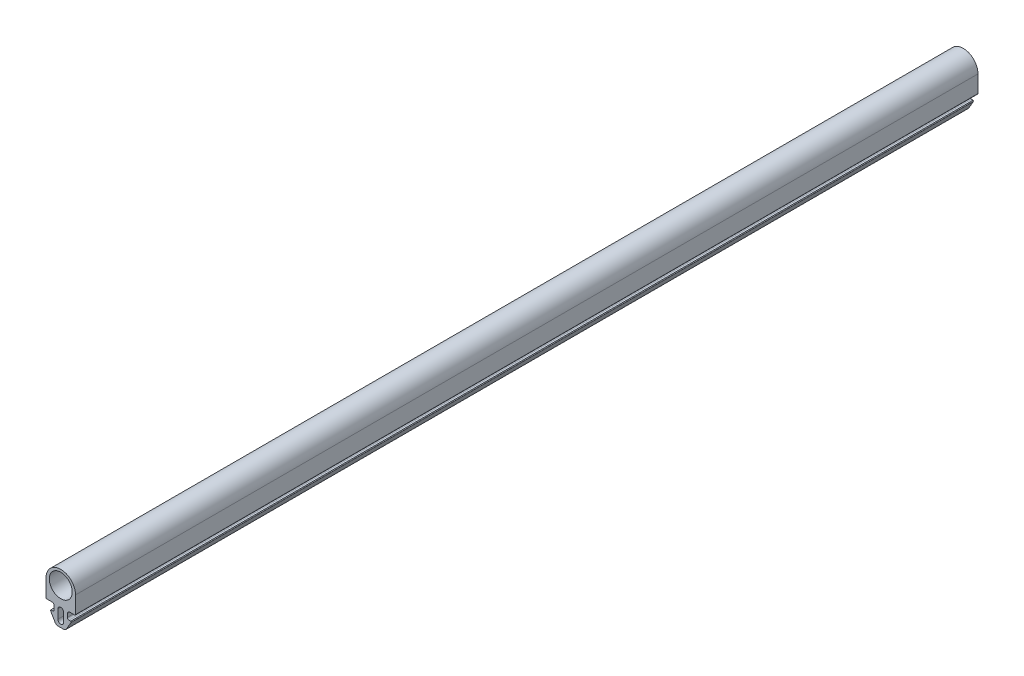
ISO-10303-21;
HEADER;
FILE_DESCRIPTION(('STEP AP214'),'2;1');
FILE_NAME('part.step','',(''),(''),'','','');
FILE_SCHEMA(('AUTOMOTIVE_DESIGN { 1 0 10303 214 1 1 1 1 }'));
ENDSEC;
DATA;
#1=APPLICATION_CONTEXT('core data for automotive mechanical design processes');
#2=APPLICATION_PROTOCOL_DEFINITION('international standard','automotive_design',2000,#1);
#3=PRODUCT_CONTEXT('',#1,'mechanical');
#4=PRODUCT('Part','Part','',(#3));
#5=PRODUCT_RELATED_PRODUCT_CATEGORY('part','',(#4));
#6=PRODUCT_DEFINITION_FORMATION('','',#4);
#7=PRODUCT_DEFINITION_CONTEXT('part definition',#1,'design');
#8=PRODUCT_DEFINITION('design','',#6,#7);
#9=PRODUCT_DEFINITION_SHAPE('','',#8);
#10=(LENGTH_UNIT() NAMED_UNIT(*) SI_UNIT(.MILLI.,.METRE.));
#11=(NAMED_UNIT(*) PLANE_ANGLE_UNIT() SI_UNIT($,.RADIAN.));
#12=(NAMED_UNIT(*) SI_UNIT($,.STERADIAN.) SOLID_ANGLE_UNIT());
#13=UNCERTAINTY_MEASURE_WITH_UNIT(LENGTH_MEASURE(1.E-05),#10,'distance_accuracy_value','');
#14=(GEOMETRIC_REPRESENTATION_CONTEXT(3) GLOBAL_UNCERTAINTY_ASSIGNED_CONTEXT((#13)) GLOBAL_UNIT_ASSIGNED_CONTEXT((#10,
#11,#12)) REPRESENTATION_CONTEXT('',''));
#15=CARTESIAN_POINT('',(0.,0.,0.));
#16=DIRECTION('',(0.,0.,1.));
#17=DIRECTION('',(1.,0.,0.));
#18=AXIS2_PLACEMENT_3D('',#15,#16,#17);
#19=CARTESIAN_POINT('',(1.89605275924265E-12,10.8645868639071,-530.));
#20=DIRECTION('',(0.,0.,1.));
#21=DIRECTION('',(1.,0.,0.));
#22=AXIS2_PLACEMENT_3D('',#19,#20,#21);
#23=CYLINDRICAL_SURFACE('',#22,8.99999999999883);
#24=CARTESIAN_POINT('',(1.89605275924265E-12,10.8645868639071,20.));
#25=DIRECTION('',(0.,0.,1.));
#26=DIRECTION('',(1.,0.,0.));
#27=AXIS2_PLACEMENT_3D('',#24,#25,#26);
#28=CIRCLE('',#27,8.99999999999883);
#29=CARTESIAN_POINT('',(9.00000000000078,10.8645868639071,20.));
#30=VERTEX_POINT('',#29);
#31=CARTESIAN_POINT('',(-8.99999999999688,10.8645868639071,20.));
#32=VERTEX_POINT('',#31);
#33=EDGE_CURVE('E245',#30,#32,#28,.T.);
#34=ORIENTED_EDGE('',*,*,#33,.F.);
#35=DIRECTION('',(0.,0.,1.));
#36=VECTOR('',#35,1.);
#37=CARTESIAN_POINT('',(9.00000000000078,10.8645868639071,-530.));
#38=LINE('',#37,#36);
#39=CARTESIAN_POINT('',(9.00000000000078,10.8645868639071,-530.));
#40=VERTEX_POINT('',#39);
#41=EDGE_CURVE('E11',#40,#30,#38,.T.);
#42=ORIENTED_EDGE('',*,*,#41,.F.);
#43=CARTESIAN_POINT('',(1.89605275924265E-12,10.8645868639071,-530.));
#44=DIRECTION('',(0.,0.,1.));
#45=DIRECTION('',(1.,0.,0.));
#46=AXIS2_PLACEMENT_3D('',#43,#44,#45);
#47=CIRCLE('',#46,8.99999999999883);
#48=CARTESIAN_POINT('',(-8.99999999999688,10.8645868639071,-530.));
#49=VERTEX_POINT('',#48);
#50=EDGE_CURVE('E249',#40,#49,#47,.T.);
#51=ORIENTED_EDGE('',*,*,#50,.T.);
#52=DIRECTION('',(0.,0.,1.));
#53=VECTOR('',#52,1.);
#54=CARTESIAN_POINT('',(-8.99999999999688,10.8645868639071,-530.));
#55=LINE('',#54,#53);
#56=EDGE_CURVE('E38',#49,#32,#55,.T.);
#57=ORIENTED_EDGE('',*,*,#56,.T.);
#58=EDGE_LOOP('',(#34,#42,#51,#57));
#59=FACE_BOUND('',#58,.T.);
#60=ADVANCED_FACE('F35',(#59),#23,.T.);
#61=CARTESIAN_POINT('',(9.00000000000088,0.52392483735149,-530.));
#62=DIRECTION('',(1.,0.,0.));
#63=DIRECTION('',(0.,1.,0.));
#64=AXIS2_PLACEMENT_3D('',#61,#62,#63);
#65=PLANE('',#64);
#66=DIRECTION('',(0.,1.,0.));
#67=VECTOR('',#66,1.);
#68=CARTESIAN_POINT('',(9.00000000000088,0.52392483735149,20.));
#69=LINE('',#68,#67);
#70=CARTESIAN_POINT('',(9.00000000000088,0.52392483735149,20.));
#71=VERTEX_POINT('',#70);
#72=EDGE_CURVE('E253',#71,#30,#69,.T.);
#73=ORIENTED_EDGE('',*,*,#72,.F.);
#74=DIRECTION('',(0.,0.,1.));
#75=VECTOR('',#74,1.);
#76=CARTESIAN_POINT('',(9.00000000000088,0.52392483735149,-530.));
#77=LINE('',#76,#75);
#78=CARTESIAN_POINT('',(9.00000000000088,0.52392483735149,-530.));
#79=VERTEX_POINT('',#78);
#80=EDGE_CURVE('E43',#79,#71,#77,.T.);
#81=ORIENTED_EDGE('',*,*,#80,.F.);
#82=DIRECTION('',(0.,1.,0.));
#83=VECTOR('',#82,1.);
#84=CARTESIAN_POINT('',(9.00000000000088,0.52392483735149,-530.));
#85=LINE('',#84,#83);
#86=EDGE_CURVE('E313',#79,#40,#85,.T.);
#87=ORIENTED_EDGE('',*,*,#86,.T.);
#88=ORIENTED_EDGE('',*,*,#41,.T.);
#89=EDGE_LOOP('',(#73,#81,#87,#88));
#90=FACE_BOUND('',#89,.T.);
#91=ADVANCED_FACE('F430',(#90),#65,.T.);
#92=CARTESIAN_POINT('',(8.50059730669664,0.499492278712887,-530.));
#93=DIRECTION('',(0.,0.,1.));
#94=DIRECTION('',(1.,0.,0.));
#95=AXIS2_PLACEMENT_3D('',#92,#93,#94);
#96=CYLINDRICAL_SURFACE('',#95,0.50000000000115);
#97=CARTESIAN_POINT('',(8.50059730669664,0.499492278712887,20.));
#98=DIRECTION('',(0.,0.,1.));
#99=DIRECTION('',(1.,0.,0.));
#100=AXIS2_PLACEMENT_3D('',#97,#98,#99);
#101=CIRCLE('',#100,0.50000000000115);
#102=CARTESIAN_POINT('',(8.47807035601008,-1.22623265708111E-13,20.));
#103=VERTEX_POINT('',#102);
#104=EDGE_CURVE('E375',#103,#71,#101,.T.);
#105=ORIENTED_EDGE('',*,*,#104,.F.);
#106=DIRECTION('',(0.,0.,1.));
#107=VECTOR('',#106,1.);
#108=CARTESIAN_POINT('',(8.47807035601008,-1.22623265708111E-13,-530.));
#109=LINE('',#108,#107);
#110=CARTESIAN_POINT('',(8.47807035601008,-1.22623265708111E-13,-530.));
#111=VERTEX_POINT('',#110);
#112=EDGE_CURVE('E381',#111,#103,#109,.T.);
#113=ORIENTED_EDGE('',*,*,#112,.F.);
#114=CARTESIAN_POINT('',(8.50059730669664,0.499492278712887,-530.));
#115=DIRECTION('',(0.,0.,1.));
#116=DIRECTION('',(1.,0.,0.));
#117=AXIS2_PLACEMENT_3D('',#114,#115,#116);
#118=CIRCLE('',#117,0.50000000000115);
#119=EDGE_CURVE('E310',#111,#79,#118,.T.);
#120=ORIENTED_EDGE('',*,*,#119,.T.);
#121=ORIENTED_EDGE('',*,*,#80,.T.);
#122=EDGE_LOOP('',(#105,#113,#120,#121));
#123=FACE_BOUND('',#122,.T.);
#124=ADVANCED_FACE('F505',(#123),#96,.T.);
#125=CARTESIAN_POINT('',(5.49999999999965,-1.15033850500712E-13,-530.));
#126=DIRECTION('',(0.,-1.,0.));
#127=DIRECTION('',(1.,0.,0.));
#128=AXIS2_PLACEMENT_3D('',#125,#126,#127);
#129=PLANE('',#128);
#130=DIRECTION('',(1.,0.,0.));
#131=VECTOR('',#130,1.);
#132=CARTESIAN_POINT('',(5.49999999999965,-1.15033850500712E-13,20.));
#133=LINE('',#132,#131);
#134=CARTESIAN_POINT('',(5.49999999999965,-1.15033850500712E-13,20.));
#135=VERTEX_POINT('',#134);
#136=EDGE_CURVE('E372',#135,#103,#133,.T.);
#137=ORIENTED_EDGE('',*,*,#136,.F.);
#138=DIRECTION('',(0.,0.,1.));
#139=VECTOR('',#138,1.);
#140=CARTESIAN_POINT('',(5.49999999999965,-1.15033850500712E-13,-530.));
#141=LINE('',#140,#139);
#142=CARTESIAN_POINT('',(5.49999999999965,-1.15033850500712E-13,-530.));
#143=VERTEX_POINT('',#142);
#144=EDGE_CURVE('E383',#143,#135,#141,.T.);
#145=ORIENTED_EDGE('',*,*,#144,.F.);
#146=DIRECTION('',(1.,0.,0.));
#147=VECTOR('',#146,1.);
#148=CARTESIAN_POINT('',(5.49999999999965,-1.15033850500712E-13,-530.));
#149=LINE('',#148,#147);
#150=EDGE_CURVE('E307',#143,#111,#149,.T.);
#151=ORIENTED_EDGE('',*,*,#150,.T.);
#152=ORIENTED_EDGE('',*,*,#112,.T.);
#153=EDGE_LOOP('',(#137,#145,#151,#152));
#154=FACE_BOUND('',#153,.T.);
#155=ADVANCED_FACE('F503',(#154),#129,.T.);
#156=CARTESIAN_POINT('',(5.49999999999963,-1.50000000000017,-530.));
#157=DIRECTION('',(0.,0.,1.));
#158=DIRECTION('',(1.,0.,0.));
#159=AXIS2_PLACEMENT_3D('',#156,#157,#158);
#160=CYLINDRICAL_SURFACE('',#159,1.50000000000001);
#161=CARTESIAN_POINT('',(5.49999999999963,-1.50000000000017,20.));
#162=DIRECTION('',(0.,0.,-1.));
#163=DIRECTION('',(-1.,0.,0.));
#164=AXIS2_PLACEMENT_3D('',#161,#162,#163);
#165=CIRCLE('',#164,1.50000000000001);
#166=CARTESIAN_POINT('',(3.99999999999962,-1.50000000000015,20.));
#167=VERTEX_POINT('',#166);
#168=EDGE_CURVE('E369',#167,#135,#165,.T.);
#169=ORIENTED_EDGE('',*,*,#168,.F.);
#170=DIRECTION('',(0.,0.,1.));
#171=VECTOR('',#170,1.);
#172=CARTESIAN_POINT('',(3.99999999999962,-1.50000000000015,-530.));
#173=LINE('',#172,#171);
#174=CARTESIAN_POINT('',(3.99999999999962,-1.50000000000015,-530.));
#175=VERTEX_POINT('',#174);
#176=EDGE_CURVE('E385',#175,#167,#173,.T.);
#177=ORIENTED_EDGE('',*,*,#176,.F.);
#178=CARTESIAN_POINT('',(5.49999999999963,-1.50000000000017,-530.));
#179=DIRECTION('',(0.,0.,-1.));
#180=DIRECTION('',(-1.,0.,0.));
#181=AXIS2_PLACEMENT_3D('',#178,#179,#180);
#182=CIRCLE('',#181,1.50000000000001);
#183=EDGE_CURVE('E304',#175,#143,#182,.T.);
#184=ORIENTED_EDGE('',*,*,#183,.T.);
#185=ORIENTED_EDGE('',*,*,#144,.T.);
#186=EDGE_LOOP('',(#169,#177,#184,#185));
#187=FACE_BOUND('',#186,.T.);
#188=ADVANCED_FACE('F499',(#187),#160,.F.);
#189=CARTESIAN_POINT('',(3.9999999999997,-3.49999999999885,-530.));
#190=DIRECTION('',(1.,0.,0.));
#191=DIRECTION('',(0.,1.,0.));
#192=AXIS2_PLACEMENT_3D('',#189,#190,#191);
#193=PLANE('',#192);
#194=DIRECTION('',(0.,1.,0.));
#195=VECTOR('',#194,1.);
#196=CARTESIAN_POINT('',(3.9999999999997,-3.49999999999885,20.));
#197=LINE('',#196,#195);
#198=CARTESIAN_POINT('',(3.9999999999997,-3.49999999999885,20.));
#199=VERTEX_POINT('',#198);
#200=EDGE_CURVE('E366',#199,#167,#197,.T.);
#201=ORIENTED_EDGE('',*,*,#200,.F.);
#202=DIRECTION('',(0.,0.,1.));
#203=VECTOR('',#202,1.);
#204=CARTESIAN_POINT('',(3.9999999999997,-3.49999999999885,-530.));
#205=LINE('',#204,#203);
#206=CARTESIAN_POINT('',(3.9999999999997,-3.49999999999885,-530.));
#207=VERTEX_POINT('',#206);
#208=EDGE_CURVE('E387',#207,#199,#205,.T.);
#209=ORIENTED_EDGE('',*,*,#208,.F.);
#210=DIRECTION('',(0.,1.,0.));
#211=VECTOR('',#210,1.);
#212=CARTESIAN_POINT('',(3.9999999999997,-3.49999999999885,-530.));
#213=LINE('',#212,#211);
#214=EDGE_CURVE('E301',#207,#175,#213,.T.);
#215=ORIENTED_EDGE('',*,*,#214,.T.);
#216=ORIENTED_EDGE('',*,*,#176,.T.);
#217=EDGE_LOOP('',(#201,#209,#215,#216));
#218=FACE_BOUND('',#217,.T.);
#219=ADVANCED_FACE('F495',(#218),#193,.T.);
#220=CARTESIAN_POINT('',(4.9999999999997,-3.49999999999885,-530.));
#221=DIRECTION('',(0.,0.,1.));
#222=DIRECTION('',(1.,0.,0.));
#223=AXIS2_PLACEMENT_3D('',#220,#221,#222);
#224=CYLINDRICAL_SURFACE('',#223,1.);
#225=CARTESIAN_POINT('',(4.9999999999997,-3.49999999999885,20.));
#226=DIRECTION('',(0.,0.,-1.));
#227=DIRECTION('',(-1.,0.,0.));
#228=AXIS2_PLACEMENT_3D('',#225,#226,#227);
#229=CIRCLE('',#228,1.);
#230=CARTESIAN_POINT('',(4.9999999999997,-4.49999999999885,20.));
#231=VERTEX_POINT('',#230);
#232=EDGE_CURVE('E363',#231,#199,#229,.T.);
#233=ORIENTED_EDGE('',*,*,#232,.F.);
#234=DIRECTION('',(0.,0.,1.));
#235=VECTOR('',#234,1.);
#236=CARTESIAN_POINT('',(4.9999999999997,-4.49999999999885,-530.));
#237=LINE('',#236,#235);
#238=CARTESIAN_POINT('',(4.9999999999997,-4.49999999999885,-530.));
#239=VERTEX_POINT('',#238);
#240=EDGE_CURVE('E389',#239,#231,#237,.T.);
#241=ORIENTED_EDGE('',*,*,#240,.F.);
#242=CARTESIAN_POINT('',(4.9999999999997,-3.49999999999885,-530.));
#243=DIRECTION('',(0.,0.,-1.));
#244=DIRECTION('',(-1.,0.,0.));
#245=AXIS2_PLACEMENT_3D('',#242,#243,#244);
#246=CIRCLE('',#245,1.);
#247=EDGE_CURVE('E298',#239,#207,#246,.T.);
#248=ORIENTED_EDGE('',*,*,#247,.T.);
#249=ORIENTED_EDGE('',*,*,#208,.T.);
#250=EDGE_LOOP('',(#233,#241,#248,#249));
#251=FACE_BOUND('',#250,.T.);
#252=ADVANCED_FACE('F491',(#251),#224,.F.);
#253=CARTESIAN_POINT('',(6.0160076135011,-4.49999999999891,-530.));
#254=DIRECTION('',(0.,1.,0.));
#255=DIRECTION('',(-1.,0.,0.));
#256=AXIS2_PLACEMENT_3D('',#253,#254,#255);
#257=PLANE('',#256);
#258=DIRECTION('',(-1.,0.,0.));
#259=VECTOR('',#258,1.);
#260=CARTESIAN_POINT('',(6.0160076135011,-4.49999999999891,20.));
#261=LINE('',#260,#259);
#262=CARTESIAN_POINT('',(6.0160076135011,-4.49999999999891,20.));
#263=VERTEX_POINT('',#262);
#264=EDGE_CURVE('E360',#263,#231,#261,.T.);
#265=ORIENTED_EDGE('',*,*,#264,.F.);
#266=DIRECTION('',(0.,0.,1.));
#267=VECTOR('',#266,1.);
#268=CARTESIAN_POINT('',(6.0160076135011,-4.49999999999891,-530.));
#269=LINE('',#268,#267);
#270=CARTESIAN_POINT('',(6.0160076135011,-4.49999999999891,-530.));
#271=VERTEX_POINT('',#270);
#272=EDGE_CURVE('E391',#271,#263,#269,.T.);
#273=ORIENTED_EDGE('',*,*,#272,.F.);
#274=DIRECTION('',(-1.,0.,0.));
#275=VECTOR('',#274,1.);
#276=CARTESIAN_POINT('',(6.0160076135011,-4.49999999999891,-530.));
#277=LINE('',#276,#275);
#278=EDGE_CURVE('E295',#271,#239,#277,.T.);
#279=ORIENTED_EDGE('',*,*,#278,.T.);
#280=ORIENTED_EDGE('',*,*,#240,.T.);
#281=EDGE_LOOP('',(#265,#273,#279,#280));
#282=FACE_BOUND('',#281,.T.);
#283=ADVANCED_FACE('F487',(#282),#257,.T.);
#284=CARTESIAN_POINT('',(5.7411809549003,-4.91769643010379,-530.));
#285=DIRECTION('',(0.,0.,1.));
#286=DIRECTION('',(1.,0.,0.));
#287=AXIS2_PLACEMENT_3D('',#284,#285,#286);
#288=CYLINDRICAL_SURFACE('',#287,0.50000000000003);
#289=CARTESIAN_POINT('',(5.7411809549003,-4.91769643010379,20.));
#290=DIRECTION('',(0.,0.,1.));
#291=DIRECTION('',(1.,0.,0.));
#292=AXIS2_PLACEMENT_3D('',#289,#290,#291);
#293=CIRCLE('',#292,0.50000000000003);
#294=CARTESIAN_POINT('',(6.17419365679255,-5.1676964301038,20.));
#295=VERTEX_POINT('',#294);
#296=EDGE_CURVE('E357',#295,#263,#293,.T.);
#297=ORIENTED_EDGE('',*,*,#296,.F.);
#298=DIRECTION('',(0.,0.,1.));
#299=VECTOR('',#298,1.);
#300=CARTESIAN_POINT('',(6.17419365679255,-5.1676964301038,-530.));
#301=LINE('',#300,#299);
#302=CARTESIAN_POINT('',(6.17419365679255,-5.1676964301038,-530.));
#303=VERTEX_POINT('',#302);
#304=EDGE_CURVE('E393',#303,#295,#301,.T.);
#305=ORIENTED_EDGE('',*,*,#304,.F.);
#306=CARTESIAN_POINT('',(5.7411809549003,-4.91769643010379,-530.));
#307=DIRECTION('',(0.,0.,1.));
#308=DIRECTION('',(1.,0.,0.));
#309=AXIS2_PLACEMENT_3D('',#306,#307,#308);
#310=CIRCLE('',#309,0.50000000000003);
#311=EDGE_CURVE('E292',#303,#271,#310,.T.);
#312=ORIENTED_EDGE('',*,*,#311,.T.);
#313=ORIENTED_EDGE('',*,*,#272,.T.);
#314=EDGE_LOOP('',(#297,#305,#312,#313));
#315=FACE_BOUND('',#314,.T.);
#316=ADVANCED_FACE('F483',(#315),#288,.T.);
#317=CARTESIAN_POINT('',(3.44004357329789,-9.90338329023524,-530.));
#318=DIRECTION('',(0.866025403784439,-0.5,0.));
#319=DIRECTION('',(0.5,0.866025403784439,0.));
#320=AXIS2_PLACEMENT_3D('',#317,#318,#319);
#321=PLANE('',#320);
#322=DIRECTION('',(0.5,0.866025403784439,0.));
#323=VECTOR('',#322,1.);
#324=CARTESIAN_POINT('',(3.44004357329789,-9.90338329023524,20.));
#325=LINE('',#324,#323);
#326=CARTESIAN_POINT('',(3.44004357329789,-9.90338329023524,20.));
#327=VERTEX_POINT('',#326);
#328=EDGE_CURVE('E354',#327,#295,#325,.T.);
#329=ORIENTED_EDGE('',*,*,#328,.F.);
#330=DIRECTION('',(0.,0.,1.));
#331=VECTOR('',#330,1.);
#332=CARTESIAN_POINT('',(3.44004357329789,-9.90338329023524,-530.));
#333=LINE('',#332,#331);
#334=CARTESIAN_POINT('',(3.44004357329789,-9.90338329023524,-530.));
#335=VERTEX_POINT('',#334);
#336=EDGE_CURVE('E395',#335,#327,#333,.T.);
#337=ORIENTED_EDGE('',*,*,#336,.F.);
#338=DIRECTION('',(0.5,0.866025403784439,0.));
#339=VECTOR('',#338,1.);
#340=CARTESIAN_POINT('',(3.44004357329789,-9.90338329023524,-530.));
#341=LINE('',#340,#339);
#342=EDGE_CURVE('E289',#335,#303,#341,.T.);
#343=ORIENTED_EDGE('',*,*,#342,.T.);
#344=ORIENTED_EDGE('',*,*,#304,.T.);
#345=EDGE_LOOP('',(#329,#337,#343,#344));
#346=FACE_BOUND('',#345,.T.);
#347=ADVANCED_FACE('F479',(#346),#321,.T.);
#348=CARTESIAN_POINT('',(1.70799276572915,-8.90338329023532,-530.));
#349=DIRECTION('',(0.,0.,1.));
#350=DIRECTION('',(1.,0.,0.));
#351=AXIS2_PLACEMENT_3D('',#348,#349,#350);
#352=CYLINDRICAL_SURFACE('',#351,1.99999999999984);
#353=CARTESIAN_POINT('',(1.70799276572915,-8.90338329023532,20.));
#354=DIRECTION('',(0.,0.,1.));
#355=DIRECTION('',(1.,0.,0.));
#356=AXIS2_PLACEMENT_3D('',#353,#354,#355);
#357=CIRCLE('',#356,1.99999999999984);
#358=CARTESIAN_POINT('',(1.70799276572915,-10.9033832902352,20.));
#359=VERTEX_POINT('',#358);
#360=EDGE_CURVE('E351',#359,#327,#357,.T.);
#361=ORIENTED_EDGE('',*,*,#360,.F.);
#362=DIRECTION('',(0.,0.,1.));
#363=VECTOR('',#362,1.);
#364=CARTESIAN_POINT('',(1.70799276572915,-10.9033832902352,-530.));
#365=LINE('',#364,#363);
#366=CARTESIAN_POINT('',(1.70799276572915,-10.9033832902352,-530.));
#367=VERTEX_POINT('',#366);
#368=EDGE_CURVE('E397',#367,#359,#365,.T.);
#369=ORIENTED_EDGE('',*,*,#368,.F.);
#370=CARTESIAN_POINT('',(1.70799276572915,-8.90338329023532,-530.));
#371=DIRECTION('',(0.,0.,1.));
#372=DIRECTION('',(1.,0.,0.));
#373=AXIS2_PLACEMENT_3D('',#370,#371,#372);
#374=CIRCLE('',#373,1.99999999999984);
#375=EDGE_CURVE('E286',#367,#335,#374,.T.);
#376=ORIENTED_EDGE('',*,*,#375,.T.);
#377=ORIENTED_EDGE('',*,*,#336,.T.);
#378=EDGE_LOOP('',(#361,#369,#376,#377));
#379=FACE_BOUND('',#378,.T.);
#380=ADVANCED_FACE('F475',(#379),#352,.T.);
#381=CARTESIAN_POINT('',(-1.70799276572332,-10.9033832902352,-530.));
#382=DIRECTION('',(0.,-1.,0.));
#383=DIRECTION('',(1.,0.,0.));
#384=AXIS2_PLACEMENT_3D('',#381,#382,#383);
#385=PLANE('',#384);
#386=DIRECTION('',(1.,0.,0.));
#387=VECTOR('',#386,1.);
#388=CARTESIAN_POINT('',(-1.70799276572332,-10.9033832902352,20.));
#389=LINE('',#388,#387);
#390=CARTESIAN_POINT('',(-1.70799276572332,-10.9033832902352,20.));
#391=VERTEX_POINT('',#390);
#392=EDGE_CURVE('E348',#391,#359,#389,.T.);
#393=ORIENTED_EDGE('',*,*,#392,.F.);
#394=DIRECTION('',(0.,0.,1.));
#395=VECTOR('',#394,1.);
#396=CARTESIAN_POINT('',(-1.70799276572332,-10.9033832902352,-530.));
#397=LINE('',#396,#395);
#398=CARTESIAN_POINT('',(-1.70799276572332,-10.9033832902352,-530.));
#399=VERTEX_POINT('',#398);
#400=EDGE_CURVE('E399',#399,#391,#397,.T.);
#401=ORIENTED_EDGE('',*,*,#400,.F.);
#402=DIRECTION('',(1.,0.,0.));
#403=VECTOR('',#402,1.);
#404=CARTESIAN_POINT('',(-1.70799276572332,-10.9033832902352,-530.));
#405=LINE('',#404,#403);
#406=EDGE_CURVE('E283',#399,#367,#405,.T.);
#407=ORIENTED_EDGE('',*,*,#406,.T.);
#408=ORIENTED_EDGE('',*,*,#368,.T.);
#409=EDGE_LOOP('',(#393,#401,#407,#408));
#410=FACE_BOUND('',#409,.T.);
#411=ADVANCED_FACE('F471',(#410),#385,.T.);
#412=CARTESIAN_POINT('',(-1.70799276572332,-8.90338329023573,-530.));
#413=DIRECTION('',(0.,0.,1.));
#414=DIRECTION('',(1.,0.,0.));
#415=AXIS2_PLACEMENT_3D('',#412,#413,#414);
#416=CYLINDRICAL_SURFACE('',#415,1.99999999999943);
#417=CARTESIAN_POINT('',(-1.70799276572332,-8.90338329023573,20.));
#418=DIRECTION('',(0.,0.,1.));
#419=DIRECTION('',(1.,0.,0.));
#420=AXIS2_PLACEMENT_3D('',#417,#418,#419);
#421=CIRCLE('',#420,1.99999999999943);
#422=CARTESIAN_POINT('',(-3.44004357329171,-9.90338329023544,20.));
#423=VERTEX_POINT('',#422);
#424=EDGE_CURVE('E345',#423,#391,#421,.T.);
#425=ORIENTED_EDGE('',*,*,#424,.F.);
#426=DIRECTION('',(0.,0.,1.));
#427=VECTOR('',#426,1.);
#428=CARTESIAN_POINT('',(-3.44004357329171,-9.90338329023544,-530.));
#429=LINE('',#428,#427);
#430=CARTESIAN_POINT('',(-3.44004357329171,-9.90338329023544,-530.));
#431=VERTEX_POINT('',#430);
#432=EDGE_CURVE('E401',#431,#423,#429,.T.);
#433=ORIENTED_EDGE('',*,*,#432,.F.);
#434=CARTESIAN_POINT('',(-1.70799276572332,-8.90338329023573,-530.));
#435=DIRECTION('',(0.,0.,1.));
#436=DIRECTION('',(1.,0.,0.));
#437=AXIS2_PLACEMENT_3D('',#434,#435,#436);
#438=CIRCLE('',#437,1.99999999999943);
#439=EDGE_CURVE('E280',#431,#399,#438,.T.);
#440=ORIENTED_EDGE('',*,*,#439,.T.);
#441=ORIENTED_EDGE('',*,*,#400,.T.);
#442=EDGE_LOOP('',(#425,#433,#440,#441));
#443=FACE_BOUND('',#442,.T.);
#444=ADVANCED_FACE('F467',(#443),#416,.T.);
#445=CARTESIAN_POINT('',(-6.17419365678656,-5.16769643010366,-530.));
#446=DIRECTION('',(-0.866025403784439,-0.5,0.));
#447=DIRECTION('',(0.5,-0.866025403784439,0.));
#448=AXIS2_PLACEMENT_3D('',#445,#446,#447);
#449=PLANE('',#448);
#450=DIRECTION('',(0.5,-0.866025403784439,0.));
#451=VECTOR('',#450,1.);
#452=CARTESIAN_POINT('',(-6.17419365678656,-5.16769643010366,20.));
#453=LINE('',#452,#451);
#454=CARTESIAN_POINT('',(-6.17419365678656,-5.16769643010366,20.));
#455=VERTEX_POINT('',#454);
#456=EDGE_CURVE('E342',#455,#423,#453,.T.);
#457=ORIENTED_EDGE('',*,*,#456,.F.);
#458=DIRECTION('',(0.,0.,1.));
#459=VECTOR('',#458,1.);
#460=CARTESIAN_POINT('',(-6.17419365678656,-5.16769643010366,-530.));
#461=LINE('',#460,#459);
#462=CARTESIAN_POINT('',(-6.17419365678656,-5.16769643010366,-530.));
#463=VERTEX_POINT('',#462);
#464=EDGE_CURVE('E403',#463,#455,#461,.T.);
#465=ORIENTED_EDGE('',*,*,#464,.F.);
#466=DIRECTION('',(0.5,-0.866025403784439,0.));
#467=VECTOR('',#466,1.);
#468=CARTESIAN_POINT('',(-6.17419365678656,-5.16769643010366,-530.));
#469=LINE('',#468,#467);
#470=EDGE_CURVE('E277',#463,#431,#469,.T.);
#471=ORIENTED_EDGE('',*,*,#470,.T.);
#472=ORIENTED_EDGE('',*,*,#432,.T.);
#473=EDGE_LOOP('',(#457,#465,#471,#472));
#474=FACE_BOUND('',#473,.T.);
#475=ADVANCED_FACE('F463',(#474),#449,.T.);
#476=CARTESIAN_POINT('',(-5.74118095489438,-4.91769643010368,-530.));
#477=DIRECTION('',(0.,0.,1.));
#478=DIRECTION('',(1.,0.,0.));
#479=AXIS2_PLACEMENT_3D('',#476,#477,#478);
#480=CYLINDRICAL_SURFACE('',#479,0.499999999999964);
#481=CARTESIAN_POINT('',(-5.74118095489438,-4.91769643010368,20.));
#482=DIRECTION('',(0.,0.,1.));
#483=DIRECTION('',(1.,0.,0.));
#484=AXIS2_PLACEMENT_3D('',#481,#482,#483);
#485=CIRCLE('',#484,0.499999999999964);
#486=CARTESIAN_POINT('',(-6.01600761349511,-4.49999999999885,20.));
#487=VERTEX_POINT('',#486);
#488=EDGE_CURVE('E339',#487,#455,#485,.T.);
#489=ORIENTED_EDGE('',*,*,#488,.F.);
#490=DIRECTION('',(0.,0.,1.));
#491=VECTOR('',#490,1.);
#492=CARTESIAN_POINT('',(-6.01600761349511,-4.49999999999885,-530.));
#493=LINE('',#492,#491);
#494=CARTESIAN_POINT('',(-6.01600761349511,-4.49999999999885,-530.));
#495=VERTEX_POINT('',#494);
#496=EDGE_CURVE('E405',#495,#487,#493,.T.);
#497=ORIENTED_EDGE('',*,*,#496,.F.);
#498=CARTESIAN_POINT('',(-5.74118095489438,-4.91769643010368,-530.));
#499=DIRECTION('',(0.,0.,1.));
#500=DIRECTION('',(1.,0.,0.));
#501=AXIS2_PLACEMENT_3D('',#498,#499,#500);
#502=CIRCLE('',#501,0.499999999999964);
#503=EDGE_CURVE('E274',#495,#463,#502,.T.);
#504=ORIENTED_EDGE('',*,*,#503,.T.);
#505=ORIENTED_EDGE('',*,*,#464,.T.);
#506=EDGE_LOOP('',(#489,#497,#504,#505));
#507=FACE_BOUND('',#506,.T.);
#508=ADVANCED_FACE('F459',(#507),#480,.T.);
#509=CARTESIAN_POINT('',(-4.99999999999678,-4.49999999999885,-530.));
#510=DIRECTION('',(0.,1.,0.));
#511=DIRECTION('',(-1.,0.,0.));
#512=AXIS2_PLACEMENT_3D('',#509,#510,#511);
#513=PLANE('',#512);
#514=DIRECTION('',(-1.,0.,0.));
#515=VECTOR('',#514,1.);
#516=CARTESIAN_POINT('',(-4.99999999999678,-4.49999999999885,20.));
#517=LINE('',#516,#515);
#518=CARTESIAN_POINT('',(-4.99999999999678,-4.49999999999885,20.));
#519=VERTEX_POINT('',#518);
#520=EDGE_CURVE('E336',#519,#487,#517,.T.);
#521=ORIENTED_EDGE('',*,*,#520,.F.);
#522=DIRECTION('',(0.,0.,1.));
#523=VECTOR('',#522,1.);
#524=CARTESIAN_POINT('',(-4.99999999999678,-4.49999999999885,-530.));
#525=LINE('',#524,#523);
#526=CARTESIAN_POINT('',(-4.99999999999678,-4.49999999999885,-530.));
#527=VERTEX_POINT('',#526);
#528=EDGE_CURVE('E407',#527,#519,#525,.T.);
#529=ORIENTED_EDGE('',*,*,#528,.F.);
#530=DIRECTION('',(-1.,0.,0.));
#531=VECTOR('',#530,1.);
#532=CARTESIAN_POINT('',(-4.99999999999678,-4.49999999999885,-530.));
#533=LINE('',#532,#531);
#534=EDGE_CURVE('E271',#527,#495,#533,.T.);
#535=ORIENTED_EDGE('',*,*,#534,.T.);
#536=ORIENTED_EDGE('',*,*,#496,.T.);
#537=EDGE_LOOP('',(#521,#529,#535,#536));
#538=FACE_BOUND('',#537,.T.);
#539=ADVANCED_FACE('F455',(#538),#513,.T.);
#540=CARTESIAN_POINT('',(-4.99999999999675,-3.49999999999889,-530.));
#541=DIRECTION('',(0.,0.,1.));
#542=DIRECTION('',(1.,0.,0.));
#543=AXIS2_PLACEMENT_3D('',#540,#541,#542);
#544=CYLINDRICAL_SURFACE('',#543,0.999999999999959);
#545=CARTESIAN_POINT('',(-4.99999999999675,-3.49999999999889,20.));
#546=DIRECTION('',(0.,0.,-1.));
#547=DIRECTION('',(-1.,0.,0.));
#548=AXIS2_PLACEMENT_3D('',#545,#546,#547);
#549=CIRCLE('',#548,0.999999999999959);
#550=CARTESIAN_POINT('',(-3.99999999999679,-3.49999999999889,20.));
#551=VERTEX_POINT('',#550);
#552=EDGE_CURVE('E333',#551,#519,#549,.T.);
#553=ORIENTED_EDGE('',*,*,#552,.F.);
#554=DIRECTION('',(0.,0.,1.));
#555=VECTOR('',#554,1.);
#556=CARTESIAN_POINT('',(-3.99999999999679,-3.49999999999889,-530.));
#557=LINE('',#556,#555);
#558=CARTESIAN_POINT('',(-3.99999999999679,-3.49999999999889,-530.));
#559=VERTEX_POINT('',#558);
#560=EDGE_CURVE('E409',#559,#551,#557,.T.);
#561=ORIENTED_EDGE('',*,*,#560,.F.);
#562=CARTESIAN_POINT('',(-4.99999999999675,-3.49999999999889,-530.));
#563=DIRECTION('',(0.,0.,-1.));
#564=DIRECTION('',(-1.,0.,0.));
#565=AXIS2_PLACEMENT_3D('',#562,#563,#564);
#566=CIRCLE('',#565,0.999999999999959);
#567=EDGE_CURVE('E268',#559,#527,#566,.T.);
#568=ORIENTED_EDGE('',*,*,#567,.T.);
#569=ORIENTED_EDGE('',*,*,#528,.T.);
#570=EDGE_LOOP('',(#553,#561,#568,#569));
#571=FACE_BOUND('',#570,.T.);
#572=ADVANCED_FACE('F451',(#571),#544,.F.);
#573=CARTESIAN_POINT('',(-3.99999999999679,-1.49999999999903,-530.));
#574=DIRECTION('',(-1.,0.,0.));
#575=DIRECTION('',(0.,-1.,0.));
#576=AXIS2_PLACEMENT_3D('',#573,#574,#575);
#577=PLANE('',#576);
#578=DIRECTION('',(0.,-1.,0.));
#579=VECTOR('',#578,1.);
#580=CARTESIAN_POINT('',(-3.99999999999679,-1.49999999999903,20.));
#581=LINE('',#580,#579);
#582=CARTESIAN_POINT('',(-3.99999999999679,-1.49999999999903,20.));
#583=VERTEX_POINT('',#582);
#584=EDGE_CURVE('E330',#583,#551,#581,.T.);
#585=ORIENTED_EDGE('',*,*,#584,.F.);
#586=DIRECTION('',(0.,0.,1.));
#587=VECTOR('',#586,1.);
#588=CARTESIAN_POINT('',(-3.99999999999679,-1.49999999999903,-530.));
#589=LINE('',#588,#587);
#590=CARTESIAN_POINT('',(-3.99999999999679,-1.49999999999903,-530.));
#591=VERTEX_POINT('',#590);
#592=EDGE_CURVE('E411',#591,#583,#589,.T.);
#593=ORIENTED_EDGE('',*,*,#592,.F.);
#594=DIRECTION('',(0.,-1.,0.));
#595=VECTOR('',#594,1.);
#596=CARTESIAN_POINT('',(-3.99999999999679,-1.49999999999903,-530.));
#597=LINE('',#596,#595);
#598=EDGE_CURVE('E265',#591,#559,#597,.T.);
#599=ORIENTED_EDGE('',*,*,#598,.T.);
#600=ORIENTED_EDGE('',*,*,#560,.T.);
#601=EDGE_LOOP('',(#585,#593,#599,#600));
#602=FACE_BOUND('',#601,.T.);
#603=ADVANCED_FACE('F447',(#602),#577,.T.);
#604=CARTESIAN_POINT('',(-5.4999999999957,-1.49999999999903,-530.));
#605=DIRECTION('',(0.,0.,1.));
#606=DIRECTION('',(1.,0.,0.));
#607=AXIS2_PLACEMENT_3D('',#604,#605,#606);
#608=CYLINDRICAL_SURFACE('',#607,1.49999999999892);
#609=CARTESIAN_POINT('',(-5.4999999999957,-1.49999999999903,20.));
#610=DIRECTION('',(0.,0.,-1.));
#611=DIRECTION('',(-1.,0.,0.));
#612=AXIS2_PLACEMENT_3D('',#609,#610,#611);
#613=CIRCLE('',#612,1.49999999999892);
#614=CARTESIAN_POINT('',(-5.4999999999957,-1.13841228110978E-13,20.));
#615=VERTEX_POINT('',#614);
#616=EDGE_CURVE('E327',#615,#583,#613,.T.);
#617=ORIENTED_EDGE('',*,*,#616,.F.);
#618=DIRECTION('',(0.,0.,1.));
#619=VECTOR('',#618,1.);
#620=CARTESIAN_POINT('',(-5.4999999999957,-1.13841228110978E-13,-530.));
#621=LINE('',#620,#619);
#622=CARTESIAN_POINT('',(-5.4999999999957,-1.13841228110978E-13,-530.));
#623=VERTEX_POINT('',#622);
#624=EDGE_CURVE('E413',#623,#615,#621,.T.);
#625=ORIENTED_EDGE('',*,*,#624,.F.);
#626=CARTESIAN_POINT('',(-5.4999999999957,-1.49999999999903,-530.));
#627=DIRECTION('',(0.,0.,-1.));
#628=DIRECTION('',(-1.,0.,0.));
#629=AXIS2_PLACEMENT_3D('',#626,#627,#628);
#630=CIRCLE('',#629,1.49999999999892);
#631=EDGE_CURVE('E262',#623,#591,#630,.T.);
#632=ORIENTED_EDGE('',*,*,#631,.T.);
#633=ORIENTED_EDGE('',*,*,#592,.T.);
#634=EDGE_LOOP('',(#617,#625,#632,#633));
#635=FACE_BOUND('',#634,.T.);
#636=ADVANCED_FACE('F443',(#635),#608,.F.);
#637=CARTESIAN_POINT('',(-8.47807035600795,-1.25821662116943E-13,-530.));
#638=DIRECTION('',(0.,-1.,0.));
#639=DIRECTION('',(1.,0.,0.));
#640=AXIS2_PLACEMENT_3D('',#637,#638,#639);
#641=PLANE('',#640);
#642=DIRECTION('',(1.,0.,0.));
#643=VECTOR('',#642,1.);
#644=CARTESIAN_POINT('',(-8.47807035600795,-1.25821662116943E-13,20.));
#645=LINE('',#644,#643);
#646=CARTESIAN_POINT('',(-8.47807035600795,-1.25821662116943E-13,20.));
#647=VERTEX_POINT('',#646);
#648=EDGE_CURVE('E324',#647,#615,#645,.T.);
#649=ORIENTED_EDGE('',*,*,#648,.F.);
#650=DIRECTION('',(0.,0.,1.));
#651=VECTOR('',#650,1.);
#652=CARTESIAN_POINT('',(-8.47807035600795,-1.25821662116943E-13,-530.));
#653=LINE('',#652,#651);
#654=CARTESIAN_POINT('',(-8.47807035600795,-1.25821662116943E-13,-530.));
#655=VERTEX_POINT('',#654);
#656=EDGE_CURVE('E415',#655,#647,#653,.T.);
#657=ORIENTED_EDGE('',*,*,#656,.F.);
#658=DIRECTION('',(1.,0.,0.));
#659=VECTOR('',#658,1.);
#660=CARTESIAN_POINT('',(-8.47807035600795,-1.25821662116943E-13,-530.));
#661=LINE('',#660,#659);
#662=EDGE_CURVE('E259',#655,#623,#661,.T.);
#663=ORIENTED_EDGE('',*,*,#662,.T.);
#664=ORIENTED_EDGE('',*,*,#624,.T.);
#665=EDGE_LOOP('',(#649,#657,#663,#664));
#666=FACE_BOUND('',#665,.T.);
#667=ADVANCED_FACE('F441',(#666),#641,.T.);
#668=CARTESIAN_POINT('',(-8.50059730669262,0.499492278712937,-530.));
#669=DIRECTION('',(0.,0.,1.));
#670=DIRECTION('',(1.,0.,0.));
#671=AXIS2_PLACEMENT_3D('',#668,#669,#670);
#672=CYLINDRICAL_SURFACE('',#671,0.500000000001122);
#673=CARTESIAN_POINT('',(-8.50059730669262,0.499492278712937,20.));
#674=DIRECTION('',(0.,0.,1.));
#675=DIRECTION('',(1.,0.,0.));
#676=AXIS2_PLACEMENT_3D('',#673,#674,#675);
#677=CIRCLE('',#676,0.500000000001122);
#678=CARTESIAN_POINT('',(-8.9999999999969,0.523924837349933,20.));
#679=VERTEX_POINT('',#678);
#680=EDGE_CURVE('E321',#679,#647,#677,.T.);
#681=ORIENTED_EDGE('',*,*,#680,.F.);
#682=DIRECTION('',(0.,0.,1.));
#683=VECTOR('',#682,1.);
#684=CARTESIAN_POINT('',(-8.9999999999969,0.523924837349933,-530.));
#685=LINE('',#684,#683);
#686=CARTESIAN_POINT('',(-8.9999999999969,0.523924837349933,-530.));
#687=VERTEX_POINT('',#686);
#688=EDGE_CURVE('E416',#687,#679,#685,.T.);
#689=ORIENTED_EDGE('',*,*,#688,.F.);
#690=CARTESIAN_POINT('',(-8.50059730669262,0.499492278712937,-530.));
#691=DIRECTION('',(0.,0.,1.));
#692=DIRECTION('',(1.,0.,0.));
#693=AXIS2_PLACEMENT_3D('',#690,#691,#692);
#694=CIRCLE('',#693,0.500000000001122);
#695=EDGE_CURVE('E256',#687,#655,#694,.T.);
#696=ORIENTED_EDGE('',*,*,#695,.T.);
#697=ORIENTED_EDGE('',*,*,#656,.T.);
#698=EDGE_LOOP('',(#681,#689,#696,#697));
#699=FACE_BOUND('',#698,.T.);
#700=ADVANCED_FACE('F437',(#699),#672,.T.);
#701=CARTESIAN_POINT('',(-8.99999999999688,10.8645868639071,-530.));
#702=DIRECTION('',(-1.,0.,0.));
#703=DIRECTION('',(0.,-1.,0.));
#704=AXIS2_PLACEMENT_3D('',#701,#702,#703);
#705=PLANE('',#704);
#706=DIRECTION('',(0.,-1.,0.));
#707=VECTOR('',#706,1.);
#708=CARTESIAN_POINT('',(-8.99999999999688,10.8645868639071,20.));
#709=LINE('',#708,#707);
#710=EDGE_CURVE('E318',#32,#679,#709,.T.);
#711=ORIENTED_EDGE('',*,*,#710,.F.);
#712=ORIENTED_EDGE('',*,*,#56,.F.);
#713=DIRECTION('',(0.,-1.,0.));
#714=VECTOR('',#713,1.);
#715=CARTESIAN_POINT('',(-8.99999999999688,10.8645868639071,-530.));
#716=LINE('',#715,#714);
#717=EDGE_CURVE('E252',#49,#687,#716,.T.);
#718=ORIENTED_EDGE('',*,*,#717,.T.);
#719=ORIENTED_EDGE('',*,*,#688,.T.);
#720=EDGE_LOOP('',(#711,#712,#718,#719));
#721=FACE_BOUND('',#720,.T.);
#722=ADVANCED_FACE('F424',(#721),#705,.T.);
#723=CARTESIAN_POINT('',(1.89605275924265E-12,10.8645868639071,-530.));
#724=DIRECTION('',(0.,0.,1.));
#725=DIRECTION('',(1.,0.,0.));
#726=AXIS2_PLACEMENT_3D('',#723,#724,#725);
#727=PLANE('',#726);
#728=CARTESIAN_POINT('',(0.,11.36,-530.));
#729=DIRECTION('',(0.,0.,1.));
#730=DIRECTION('',(-1.,0.,0.));
#731=AXIS2_PLACEMENT_3D('',#728,#729,#730);
#732=CIRCLE('',#731,7.);
#733=CARTESIAN_POINT('',(-7.,11.36,-530.));
#734=VERTEX_POINT('',#733);
#735=EDGE_CURVE('E239',#734,#734,#732,.T.);
#736=ORIENTED_EDGE('',*,*,#735,.T.);
#737=EDGE_LOOP('',(#736));
#738=FACE_BOUND('',#737,.T.);
#739=DIRECTION('',(0.,1.,0.));
#740=VECTOR('',#739,1.);
#741=CARTESIAN_POINT('',(1.7500000000002,-1.95338329023615,-530.));
#742=LINE('',#741,#740);
#743=CARTESIAN_POINT('',(1.75000000000019,-7.3515288385757,-530.));
#744=VERTEX_POINT('',#743);
#745=CARTESIAN_POINT('',(1.7500000000002,-1.95338329023615,-530.));
#746=VERTEX_POINT('',#745);
#747=EDGE_CURVE('E216',#744,#746,#742,.T.);
#748=ORIENTED_EDGE('',*,*,#747,.T.);
#749=CARTESIAN_POINT('',(1.70111320862976E-13,-1.95338329023613,-530.));
#750=DIRECTION('',(0.,0.,1.));
#751=DIRECTION('',(-1.,0.,0.));
#752=AXIS2_PLACEMENT_3D('',#749,#750,#751);
#753=CIRCLE('',#752,1.75);
#754=CARTESIAN_POINT('',(-1.74999999999979,-1.95338329023617,-530.));
#755=VERTEX_POINT('',#754);
#756=EDGE_CURVE('E210',#746,#755,#753,.T.);
#757=ORIENTED_EDGE('',*,*,#756,.T.);
#758=DIRECTION('',(0.,-1.,0.));
#759=VECTOR('',#758,1.);
#760=CARTESIAN_POINT('',(-1.74999999999978,-7.35152883857567,-530.));
#761=LINE('',#760,#759);
#762=CARTESIAN_POINT('',(-1.74999999999978,-7.35152883857567,-530.));
#763=VERTEX_POINT('',#762);
#764=EDGE_CURVE('E219',#755,#763,#761,.T.);
#765=ORIENTED_EDGE('',*,*,#764,.T.);
#766=CARTESIAN_POINT('',(2.02203705168547E-13,-7.3515288385757,-530.));
#767=DIRECTION('',(0.,0.,1.));
#768=DIRECTION('',(-1.,0.,0.));
#769=AXIS2_PLACEMENT_3D('',#766,#767,#768);
#770=CIRCLE('',#769,1.74999999999999);
#771=EDGE_CURVE('E51',#763,#744,#770,.T.);
#772=ORIENTED_EDGE('',*,*,#771,.T.);
#773=EDGE_LOOP('',(#748,#757,#765,#772));
#774=FACE_BOUND('',#773,.T.);
#775=ORIENTED_EDGE('',*,*,#50,.F.);
#776=ORIENTED_EDGE('',*,*,#86,.F.);
#777=ORIENTED_EDGE('',*,*,#119,.F.);
#778=ORIENTED_EDGE('',*,*,#150,.F.);
#779=ORIENTED_EDGE('',*,*,#183,.F.);
#780=ORIENTED_EDGE('',*,*,#214,.F.);
#781=ORIENTED_EDGE('',*,*,#247,.F.);
#782=ORIENTED_EDGE('',*,*,#278,.F.);
#783=ORIENTED_EDGE('',*,*,#311,.F.);
#784=ORIENTED_EDGE('',*,*,#342,.F.);
#785=ORIENTED_EDGE('',*,*,#375,.F.);
#786=ORIENTED_EDGE('',*,*,#406,.F.);
#787=ORIENTED_EDGE('',*,*,#439,.F.);
#788=ORIENTED_EDGE('',*,*,#470,.F.);
#789=ORIENTED_EDGE('',*,*,#503,.F.);
#790=ORIENTED_EDGE('',*,*,#534,.F.);
#791=ORIENTED_EDGE('',*,*,#567,.F.);
#792=ORIENTED_EDGE('',*,*,#598,.F.);
#793=ORIENTED_EDGE('',*,*,#631,.F.);
#794=ORIENTED_EDGE('',*,*,#662,.F.);
#795=ORIENTED_EDGE('',*,*,#695,.F.);
#796=ORIENTED_EDGE('',*,*,#717,.F.);
#797=EDGE_LOOP('',(#775,#776,#777,#778,#779,#780,#781,#782,#783,#784,#785,#786,#787,#788,#789,
#790,#791,#792,#793,#794,#795,#796));
#798=FACE_BOUND('',#797,.T.);
#799=ADVANCED_FACE('F223',(#738,#774,#798),#727,.F.);
#800=CARTESIAN_POINT('',(1.89605275924265E-12,10.8645868639071,20.));
#801=DIRECTION('',(0.,0.,1.));
#802=DIRECTION('',(1.,0.,0.));
#803=AXIS2_PLACEMENT_3D('',#800,#801,#802);
#804=PLANE('',#803);
#805=CARTESIAN_POINT('',(0.,11.36,20.));
#806=DIRECTION('',(0.,0.,1.));
#807=DIRECTION('',(-1.,0.,0.));
#808=AXIS2_PLACEMENT_3D('',#805,#806,#807);
#809=CIRCLE('',#808,7.);
#810=CARTESIAN_POINT('',(-7.,11.36,20.));
#811=VERTEX_POINT('',#810);
#812=EDGE_CURVE('E232',#811,#811,#809,.T.);
#813=ORIENTED_EDGE('',*,*,#812,.F.);
#814=EDGE_LOOP('',(#813));
#815=FACE_BOUND('',#814,.T.);
#816=CARTESIAN_POINT('',(1.70111320862976E-13,-1.95338329023613,20.));
#817=DIRECTION('',(0.,0.,1.));
#818=DIRECTION('',(-1.,0.,0.));
#819=AXIS2_PLACEMENT_3D('',#816,#817,#818);
#820=CIRCLE('',#819,1.75);
#821=CARTESIAN_POINT('',(1.7500000000002,-1.95338329023615,20.));
#822=VERTEX_POINT('',#821);
#823=CARTESIAN_POINT('',(-1.74999999999979,-1.95338329023617,20.));
#824=VERTEX_POINT('',#823);
#825=EDGE_CURVE('E59',#822,#824,#820,.T.);
#826=ORIENTED_EDGE('',*,*,#825,.F.);
#827=DIRECTION('',(0.,1.,0.));
#828=VECTOR('',#827,1.);
#829=CARTESIAN_POINT('',(1.7500000000002,-1.95338329023615,20.));
#830=LINE('',#829,#828);
#831=CARTESIAN_POINT('',(1.75000000000019,-7.3515288385757,20.));
#832=VERTEX_POINT('',#831);
#833=EDGE_CURVE('E226',#832,#822,#830,.T.);
#834=ORIENTED_EDGE('',*,*,#833,.F.);
#835=CARTESIAN_POINT('',(2.02203705168547E-13,-7.3515288385757,20.));
#836=DIRECTION('',(0.,0.,1.));
#837=DIRECTION('',(-1.,0.,0.));
#838=AXIS2_PLACEMENT_3D('',#835,#836,#837);
#839=CIRCLE('',#838,1.74999999999999);
#840=CARTESIAN_POINT('',(-1.74999999999978,-7.35152883857567,20.));
#841=VERTEX_POINT('',#840);
#842=EDGE_CURVE('E229',#841,#832,#839,.T.);
#843=ORIENTED_EDGE('',*,*,#842,.F.);
#844=DIRECTION('',(0.,-1.,0.));
#845=VECTOR('',#844,1.);
#846=CARTESIAN_POINT('',(-1.74999999999978,-7.35152883857567,20.));
#847=LINE('',#846,#845);
#848=EDGE_CURVE('E238',#824,#841,#847,.T.);
#849=ORIENTED_EDGE('',*,*,#848,.F.);
#850=EDGE_LOOP('',(#826,#834,#843,#849));
#851=FACE_BOUND('',#850,.T.);
#852=ORIENTED_EDGE('',*,*,#33,.T.);
#853=ORIENTED_EDGE('',*,*,#710,.T.);
#854=ORIENTED_EDGE('',*,*,#680,.T.);
#855=ORIENTED_EDGE('',*,*,#648,.T.);
#856=ORIENTED_EDGE('',*,*,#616,.T.);
#857=ORIENTED_EDGE('',*,*,#584,.T.);
#858=ORIENTED_EDGE('',*,*,#552,.T.);
#859=ORIENTED_EDGE('',*,*,#520,.T.);
#860=ORIENTED_EDGE('',*,*,#488,.T.);
#861=ORIENTED_EDGE('',*,*,#456,.T.);
#862=ORIENTED_EDGE('',*,*,#424,.T.);
#863=ORIENTED_EDGE('',*,*,#392,.T.);
#864=ORIENTED_EDGE('',*,*,#360,.T.);
#865=ORIENTED_EDGE('',*,*,#328,.T.);
#866=ORIENTED_EDGE('',*,*,#296,.T.);
#867=ORIENTED_EDGE('',*,*,#264,.T.);
#868=ORIENTED_EDGE('',*,*,#232,.T.);
#869=ORIENTED_EDGE('',*,*,#200,.T.);
#870=ORIENTED_EDGE('',*,*,#168,.T.);
#871=ORIENTED_EDGE('',*,*,#136,.T.);
#872=ORIENTED_EDGE('',*,*,#104,.T.);
#873=ORIENTED_EDGE('',*,*,#72,.T.);
#874=EDGE_LOOP('',(#852,#853,#854,#855,#856,#857,#858,#859,#860,#861,#862,#863,#864,#865,#866,
#867,#868,#869,#870,#871,#872,#873));
#875=FACE_BOUND('',#874,.T.);
#876=ADVANCED_FACE('F426',(#815,#851,#875),#804,.T.);
#877=CARTESIAN_POINT('',(1.70111320862976E-13,-1.95338329023613,-530.));
#878=DIRECTION('',(0.,0.,1.));
#879=DIRECTION('',(1.,0.,0.));
#880=AXIS2_PLACEMENT_3D('',#877,#878,#879);
#881=CYLINDRICAL_SURFACE('',#880,1.75);
#882=ORIENTED_EDGE('',*,*,#825,.T.);
#883=DIRECTION('',(0.,0.,1.));
#884=VECTOR('',#883,1.);
#885=CARTESIAN_POINT('',(-1.74999999999979,-1.95338329023617,-530.));
#886=LINE('',#885,#884);
#887=EDGE_CURVE('E206',#755,#824,#886,.T.);
#888=ORIENTED_EDGE('',*,*,#887,.F.);
#889=ORIENTED_EDGE('',*,*,#756,.F.);
#890=DIRECTION('',(0.,0.,1.));
#891=VECTOR('',#890,1.);
#892=CARTESIAN_POINT('',(1.7500000000002,-1.95338329023615,-530.));
#893=LINE('',#892,#891);
#894=EDGE_CURVE('E243',#746,#822,#893,.T.);
#895=ORIENTED_EDGE('',*,*,#894,.T.);
#896=EDGE_LOOP('',(#882,#888,#889,#895));
#897=FACE_BOUND('',#896,.T.);
#898=ADVANCED_FACE('F208',(#897),#881,.F.);
#899=CARTESIAN_POINT('',(1.7500000000002,-1.95338329023615,-530.));
#900=DIRECTION('',(1.,0.,0.));
#901=DIRECTION('',(0.,1.,0.));
#902=AXIS2_PLACEMENT_3D('',#899,#900,#901);
#903=PLANE('',#902);
#904=ORIENTED_EDGE('',*,*,#833,.T.);
#905=ORIENTED_EDGE('',*,*,#894,.F.);
#906=ORIENTED_EDGE('',*,*,#747,.F.);
#907=DIRECTION('',(0.,0.,1.));
#908=VECTOR('',#907,1.);
#909=CARTESIAN_POINT('',(1.75000000000019,-7.3515288385757,-530.));
#910=LINE('',#909,#908);
#911=EDGE_CURVE('E246',#744,#832,#910,.T.);
#912=ORIENTED_EDGE('',*,*,#911,.T.);
#913=EDGE_LOOP('',(#904,#905,#906,#912));
#914=FACE_BOUND('',#913,.T.);
#915=ADVANCED_FACE('F701',(#914),#903,.F.);
#916=CARTESIAN_POINT('',(2.02203705168547E-13,-7.3515288385757,-530.));
#917=DIRECTION('',(0.,0.,1.));
#918=DIRECTION('',(1.,0.,0.));
#919=AXIS2_PLACEMENT_3D('',#916,#917,#918);
#920=CYLINDRICAL_SURFACE('',#919,1.74999999999999);
#921=ORIENTED_EDGE('',*,*,#842,.T.);
#922=ORIENTED_EDGE('',*,*,#911,.F.);
#923=ORIENTED_EDGE('',*,*,#771,.F.);
#924=DIRECTION('',(0.,0.,1.));
#925=VECTOR('',#924,1.);
#926=CARTESIAN_POINT('',(-1.74999999999978,-7.35152883857567,-530.));
#927=LINE('',#926,#925);
#928=EDGE_CURVE('E215',#763,#841,#927,.T.);
#929=ORIENTED_EDGE('',*,*,#928,.T.);
#930=EDGE_LOOP('',(#921,#922,#923,#929));
#931=FACE_BOUND('',#930,.T.);
#932=ADVANCED_FACE('F710',(#931),#920,.F.);
#933=CARTESIAN_POINT('',(-1.74999999999978,-7.35152883857567,-530.));
#934=DIRECTION('',(-1.,0.,0.));
#935=DIRECTION('',(0.,-1.,0.));
#936=AXIS2_PLACEMENT_3D('',#933,#934,#935);
#937=PLANE('',#936);
#938=ORIENTED_EDGE('',*,*,#848,.T.);
#939=ORIENTED_EDGE('',*,*,#928,.F.);
#940=ORIENTED_EDGE('',*,*,#764,.F.);
#941=ORIENTED_EDGE('',*,*,#887,.T.);
#942=EDGE_LOOP('',(#938,#939,#940,#941));
#943=FACE_BOUND('',#942,.T.);
#944=ADVANCED_FACE('F220',(#943),#937,.F.);
#945=CARTESIAN_POINT('',(0.,11.36,-530.));
#946=DIRECTION('',(0.,0.,1.));
#947=DIRECTION('',(1.,0.,0.));
#948=AXIS2_PLACEMENT_3D('',#945,#946,#947);
#949=CYLINDRICAL_SURFACE('',#948,7.);
#950=ORIENTED_EDGE('',*,*,#735,.F.);
#951=EDGE_LOOP('',(#950));
#952=FACE_BOUND('',#951,.T.);
#953=ORIENTED_EDGE('',*,*,#812,.T.);
#954=EDGE_LOOP('',(#953));
#955=FACE_BOUND('',#954,.T.);
#956=ADVANCED_FACE('F728',(#952,#955),#949,.F.);
#957=CLOSED_SHELL('',(#60,#91,#124,#155,#188,#219,#252,#283,#316,#347,#380,#411,#444,#475,#508,
#539,#572,#603,#636,#667,#700,#722,#799,#876,#898,#915,#932,#944,#956));
#958=MANIFOLD_SOLID_BREP('B2',#957);
#959=ADVANCED_BREP_SHAPE_REPRESENTATION('',(#18,#958),#14);
#960=SHAPE_DEFINITION_REPRESENTATION(#9,#959);
ENDSEC;
END-ISO-10303-21;
